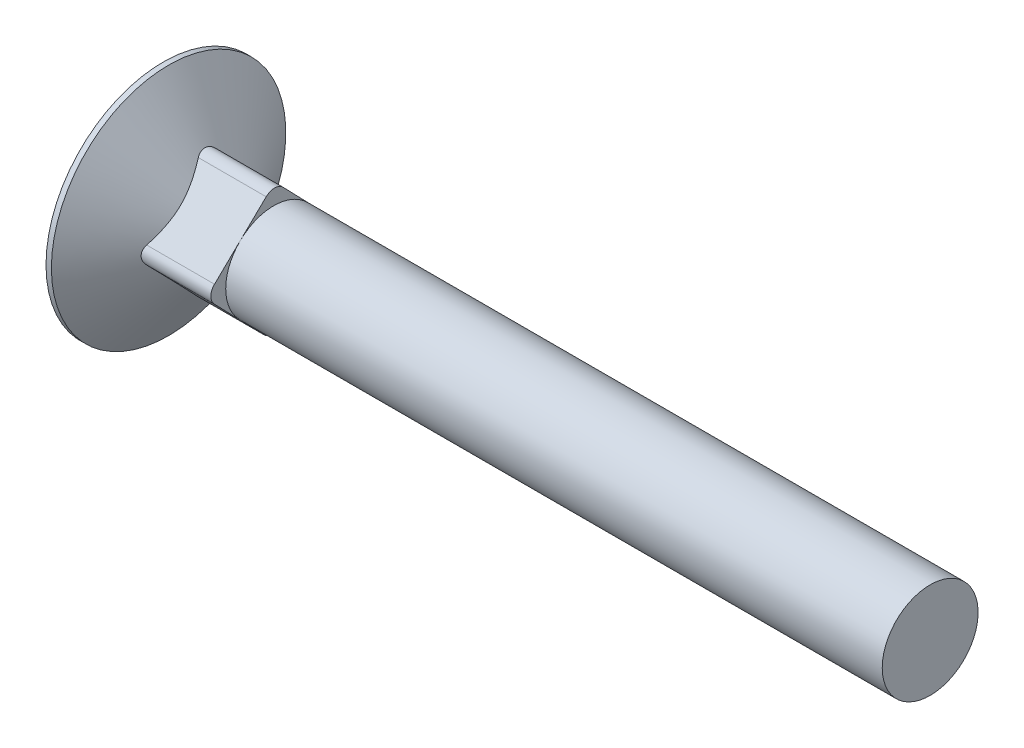
ISO-10303-21;
HEADER;
FILE_DESCRIPTION(('STEP AP214'),'2;1');
FILE_NAME('part.step','',(''),(''),'','','');
FILE_SCHEMA(('AUTOMOTIVE_DESIGN { 1 0 10303 214 1 1 1 1 }'));
ENDSEC;
DATA;
#1=APPLICATION_CONTEXT('core data for automotive mechanical design processes');
#2=APPLICATION_PROTOCOL_DEFINITION('international standard','automotive_design',2000,#1);
#3=PRODUCT_CONTEXT('',#1,'mechanical');
#4=PRODUCT('Part','Part','',(#3));
#5=PRODUCT_RELATED_PRODUCT_CATEGORY('part','',(#4));
#6=PRODUCT_DEFINITION_FORMATION('','',#4);
#7=PRODUCT_DEFINITION_CONTEXT('part definition',#1,'design');
#8=PRODUCT_DEFINITION('design','',#6,#7);
#9=PRODUCT_DEFINITION_SHAPE('','',#8);
#10=(LENGTH_UNIT() NAMED_UNIT(*) SI_UNIT(.MILLI.,.METRE.));
#11=(NAMED_UNIT(*) PLANE_ANGLE_UNIT() SI_UNIT($,.RADIAN.));
#12=(NAMED_UNIT(*) SI_UNIT($,.STERADIAN.) SOLID_ANGLE_UNIT());
#13=UNCERTAINTY_MEASURE_WITH_UNIT(LENGTH_MEASURE(1.E-05),#10,'distance_accuracy_value','');
#14=(GEOMETRIC_REPRESENTATION_CONTEXT(3) GLOBAL_UNCERTAINTY_ASSIGNED_CONTEXT((#13)) GLOBAL_UNIT_ASSIGNED_CONTEXT((#10,
#11,#12)) REPRESENTATION_CONTEXT('',''));
#15=CARTESIAN_POINT('',(0.,0.,0.));
#16=DIRECTION('',(0.,0.,1.));
#17=DIRECTION('',(1.,0.,0.));
#18=AXIS2_PLACEMENT_3D('',#15,#16,#17);
#19=CARTESIAN_POINT('',(0.533667772984279,0.,0.));
#20=DIRECTION('',(-1.,0.,0.));
#21=DIRECTION('',(0.,0.,1.));
#22=AXIS2_PLACEMENT_3D('',#19,#20,#21);
#23=CONICAL_SURFACE('',#22,11.6459,0.99483767363677);
#24=CARTESIAN_POINT('',(0.533667772984279,0.,0.));
#25=DIRECTION('',(-1.,0.,0.));
#26=DIRECTION('',(0.,0.,1.));
#27=AXIS2_PLACEMENT_3D('',#24,#25,#26);
#28=CIRCLE('',#27,11.6459);
#29=CARTESIAN_POINT('',(0.533667772984279,0.,11.6459));
#30=VERTEX_POINT('',#29);
#31=EDGE_CURVE('E217',#30,#30,#28,.T.);
#32=ORIENTED_EDGE('',*,*,#31,.F.);
#33=EDGE_LOOP('',(#32));
#34=FACE_BOUND('',#33,.T.);
#35=CARTESIAN_POINT('',(0.532123041290795,-10.9550309494248,-3.95849631330671));
#36=CARTESIAN_POINT('',(0.694883305885897,-10.7574427642457,-3.76768762084474));
#37=CARTESIAN_POINT('',(0.856904846749187,-10.559536579679,-3.57657183994382));
#38=CARTESIAN_POINT('',(1.17901780097643,-10.1628911856194,-3.19353583532146));
#39=CARTESIAN_POINT('',(1.33910905013607,-9.96415190716858,-3.00161554500828));
#40=CARTESIAN_POINT('',(1.65750023531262,-9.56490022741344,-2.61606267954588));
#41=CARTESIAN_POINT('',(1.815790759882,-9.36438393446509,-2.42242634627973));
#42=CARTESIAN_POINT('',(2.12924998907705,-8.96210112031733,-2.03394634835944));
#43=CARTESIAN_POINT('',(2.28441881792161,-8.76033464928472,-1.8391027321508));
#44=CARTESIAN_POINT('',(2.60253582699258,-8.33956733464612,-1.43277245959859));
#45=CARTESIAN_POINT('',(2.76515930232245,-8.12043891447615,-1.22116260399924));
#46=CARTESIAN_POINT('',(3.08403633959269,-7.67975137769285,-0.795595596530226));
#47=CARTESIAN_POINT('',(3.24028905207808,-7.45819194190246,-0.581638136434864));
#48=CARTESIAN_POINT('',(3.54365698242045,-7.01226444908306,-0.151010962241306));
#49=CARTESIAN_POINT('',(3.69078656178386,-6.78790151075154,0.0656538087881817));
#50=CARTESIAN_POINT('',(3.9018860636838,-6.4482959060101,0.393607129148561));
#51=CARTESIAN_POINT('',(3.97064730438402,-6.33459485484101,0.503406957946311));
#52=CARTESIAN_POINT('',(4.10429383413234,-6.10602334937034,0.724135895020092));
#53=CARTESIAN_POINT('',(4.16917940964336,-5.99115298223306,0.835064919122534));
#54=CARTESIAN_POINT('',(4.28177385213875,-5.78317650362175,1.03590546994137));
#55=CARTESIAN_POINT('',(4.33032469203292,-5.69030669237302,1.12558880418273));
#56=CARTESIAN_POINT('',(4.42392347547044,-5.50366905827458,1.30582267238815));
#57=CARTESIAN_POINT('',(4.46897188440253,-5.40990135659897,1.39637308933573));
#58=CARTESIAN_POINT('',(4.55500361240024,-5.22139771774512,1.57840893738719));
#59=CARTESIAN_POINT('',(4.59598693491075,-5.12666178138745,1.66989436769863));
#60=CARTESIAN_POINT('',(4.67326581971078,-4.93616450219971,1.85385545184152));
#61=CARTESIAN_POINT('',(4.70955912073257,-4.84040268866558,1.94633156022659));
#62=CARTESIAN_POINT('',(4.8091295722398,-4.55502583102604,2.22191678823882));
#63=CARTESIAN_POINT('',(4.86468926695932,-4.36393297493133,2.40645301431531));
#64=CARTESIAN_POINT('',(4.92839312137092,-4.07513434538459,2.68534260904826));
#65=CARTESIAN_POINT('',(4.94635423180549,-3.97851895337449,2.77864300858599));
#66=CARTESIAN_POINT('',(4.97522467462377,-3.78474984513787,2.96576366131448));
#67=CARTESIAN_POINT('',(4.98613520448874,-3.68759622315363,3.05958382349651));
#68=CARTESIAN_POINT('',(5.00114339716809,-3.48493042769018,3.25529590721291));
#69=CARTESIAN_POINT('',(5.00460096604075,-3.37939330262308,3.35721192421562));
#70=CARTESIAN_POINT('',(5.00268671479131,-3.16837391126736,3.56099098171446));
#71=CARTESIAN_POINT('',(4.99731590967165,-3.06289164006686,3.66285402695393));
#72=CARTESIAN_POINT('',(4.9779534359453,-2.85227904418269,3.86624024663226));
#73=CARTESIAN_POINT('',(4.96395674225568,-2.74714896058819,3.96776318825399));
#74=CARTESIAN_POINT('',(4.92786642620277,-2.53761848941634,4.17010441224469));
#75=CARTESIAN_POINT('',(4.90577242356377,-2.43321813634418,4.27092266129238));
#76=CARTESIAN_POINT('',(4.82813110584011,-2.12026583829367,4.57313718256983));
#77=CARTESIAN_POINT('',(4.76134680890009,-1.91314141705631,4.77315491114715));
#78=CARTESIAN_POINT('',(4.60493800089672,-1.50360200792325,5.16864252138808));
#79=CARTESIAN_POINT('',(4.51531621546499,-1.30118646117193,5.36411294273226));
#80=CARTESIAN_POINT('',(4.38782773749266,-1.04048098732727,5.61587329235482));
#81=CARTESIAN_POINT('',(4.35750714683464,-0.980222374645196,5.67406435820734));
#82=CARTESIAN_POINT('',(4.29557102761551,-0.860252977828867,5.78991745803325));
#83=CARTESIAN_POINT('',(4.26395962824818,-0.800541096155745,5.84758055188759));
#84=CARTESIAN_POINT('',(4.13398057102106,-0.560445755067062,6.0794379276604));
#85=CARTESIAN_POINT('',(4.03052564295983,-0.381483021050886,6.25226023100861));
#86=CARTESIAN_POINT('',(3.81514593234282,-0.0262023184638804,6.59535081740246));
#87=CARTESIAN_POINT('',(3.70321920398406,0.150115031304611,6.76561850287762));
#88=CARTESIAN_POINT('',(3.47287138891358,0.500787385453553,7.10425885891443));
#89=CARTESIAN_POINT('',(3.35444275736194,0.675139814497862,7.27262904250286));
#90=CARTESIAN_POINT('',(3.11274095005767,1.02207115491802,7.60765674357538));
#91=CARTESIAN_POINT('',(2.98946819067199,1.1946502171184,7.77431440670902));
#92=CARTESIAN_POINT('',(2.73739552336886,1.54081564270367,8.10860247242303));
#93=CARTESIAN_POINT('',(2.6085421377194,1.71438179897009,8.27621336121592));
#94=CARTESIAN_POINT('',(2.34779855612206,2.06033522547009,8.61029670179302));
#95=CARTESIAN_POINT('',(2.21590824900712,2.23272245224822,8.77676911161278));
#96=CARTESIAN_POINT('',(1.95011606357901,2.57601874349071,9.10828648649856));
#97=CARTESIAN_POINT('',(1.81622133982908,2.74693068021054,9.27333422526944));
#98=CARTESIAN_POINT('',(1.54648946996914,3.08793964005009,9.60264274989512));
#99=CARTESIAN_POINT('',(1.41065250096732,3.25803673560831,9.76690360570298));
#100=CARTESIAN_POINT('',(1.27405768176842,3.42781483359704,9.93085640913879));
#101=B_SPLINE_CURVE_WITH_KNOTS('',3,(#35,#36,#37,#38,#39,#40,#41,#42,#43,#44,#45,#46,#47,#48,
#49,#50,#51,#52,#53,#54,#55,#56,#57,#58,#59,#60,#61,#62,#63,#64,#65,#66,#67,#68,#69,#70,#71,#72,
#73,#74,#75,#76,#77,#78,#79,#80,#81,#82,#83,#84,#85,#86,#87,#88,#89,#90,#91,#92,#93,#94,#95,#96,
#97,#98,#99,#100),.UNSPECIFIED.,.F.,.F.,(4,2,2,2,2,2,2,2,2,2,2,2,2,2,2,2,2,2,2,2,2,2,2,2,2,2,2,
2,2,2,2,2,4),(0.,0.95784549062588,1.91577189554515,2.87743116851151,3.83905209902266,
4.87493924740397,5.91096406860663,6.94531427018273,7.46239051069423,7.97942848501689,
8.39318007820668,8.80687659947793,9.22057277016639,9.63446766381766,10.4473829126597,
10.8537514591056,11.2600509691511,11.7000480529326,12.1399945535738,12.5801975912853,
13.0204213049997,13.9057728879746,14.7910188545648,15.0582778961124,15.3247403210123,
16.1328150541036,16.941075952293,17.7502954435732,18.5594455315611,19.3800254979938,
20.2006355498063,21.0188034570577,21.8368972276177),.UNSPECIFIED.);
#102=CARTESIAN_POINT('',(4.23183585380931,-5.87541843477951,0.946828472455797));
#103=VERTEX_POINT('',#102);
#104=CARTESIAN_POINT('',(4.23183585380931,-0.741202543842446,5.90488312576984));
#105=VERTEX_POINT('',#104);
#106=EDGE_CURVE('E219',#103,#105,#101,.T.);
#107=ORIENTED_EDGE('',*,*,#106,.T.);
#108=CARTESIAN_POINT('',(4.37943289920209,-0.944352041683079,5.64550263989267));
#109=CARTESIAN_POINT('',(4.35251225172138,-0.917354132931146,5.69204724154072));
#110=CARTESIAN_POINT('',(4.32662869695987,-0.886884125443231,5.73724384122035));
#111=CARTESIAN_POINT('',(4.27730445989733,-0.819163258147915,5.82401425528748));
#112=CARTESIAN_POINT('',(4.25387265363763,-0.781889016305476,5.86557482288635));
#113=CARTESIAN_POINT('',(4.20811926058557,-0.697414775813878,5.94718776325859));
#114=CARTESIAN_POINT('',(4.18606893038301,-0.649635161773335,5.98679887910775));
#115=CARTESIAN_POINT('',(4.1461706169182,-0.547346289719177,6.05870307076282));
#116=CARTESIAN_POINT('',(4.12831825154221,-0.49284414058278,6.09100377632496));
#117=CARTESIAN_POINT('',(4.09731214307697,-0.378030410428736,6.14704165674633));
#118=CARTESIAN_POINT('',(4.08417889442371,-0.317694900334177,6.1707414835774));
#119=CARTESIAN_POINT('',(4.06322968863274,-0.193106073925886,6.2081677903357));
#120=CARTESIAN_POINT('',(4.05541340663272,-0.128852997233685,6.22189487959252));
#121=CARTESIAN_POINT('',(4.04574485411586,-0.00264031252691654,6.23807479779838));
#122=CARTESIAN_POINT('',(4.04354853264181,0.0592095301618625,6.24118215921113));
#123=CARTESIAN_POINT('',(4.04420106628737,0.182610404380761,6.23778541154474));
#124=CARTESIAN_POINT('',(4.04704886940564,0.244161495533861,6.23128330666027));
#125=CARTESIAN_POINT('',(4.05748932447082,0.362978053386332,6.20936879796813));
#126=CARTESIAN_POINT('',(4.06491236725712,0.420318116612145,6.19427631610405));
#127=CARTESIAN_POINT('',(4.0840854835171,0.531468550043161,6.15609939683231));
#128=CARTESIAN_POINT('',(4.09583456740429,0.585279724171558,6.13301678724709));
#129=CARTESIAN_POINT('',(4.12522430278153,0.695392102351437,6.0760331437259));
#130=CARTESIAN_POINT('',(4.14345974773104,0.750985972825143,6.04106952096783));
#131=CARTESIAN_POINT('',(4.1844626128213,0.854790770186582,5.96348587076843));
#132=CARTESIAN_POINT('',(4.20724090871505,0.902983478652354,5.92084749403387));
#133=CARTESIAN_POINT('',(4.26048053218472,0.997893017223193,5.82250913972399));
#134=CARTESIAN_POINT('',(4.29158558581266,1.0432204734331,5.7658090287272));
#135=CARTESIAN_POINT('',(4.34119373767082,1.10229290973849,5.6768498995237));
#136=CARTESIAN_POINT('',(4.35819619117371,1.12047838440711,5.64658957918647));
#137=CARTESIAN_POINT('',(4.39308026592529,1.15391048061844,5.58501172951802));
#138=CARTESIAN_POINT('',(4.41096112561856,1.16915959338292,5.55369512309316));
#139=CARTESIAN_POINT('',(4.42923880957495,1.18295598201111,5.52195706550892));
#140=B_SPLINE_CURVE_WITH_KNOTS('',3,(#108,#109,#110,#111,#112,#113,#114,#115,#116,#117,#118,
#119,#120,#121,#122,#123,#124,#125,#126,#127,#128,#129,#130,#131,#132,#133,#134,#135,#136,#137,
#138,#139),.UNSPECIFIED.,.F.,.F.,(4,2,2,2,2,2,2,2,2,2,2,2,2,2,2,4),(0.,0.180452366289675,
0.361536928854048,0.558281798116494,0.754820371197439,0.952202450810284,1.14957246945646,
1.33453429148954,1.51945754247436,1.69790657618928,1.87631481483309,2.07971777142122,
2.28361365741995,2.51914795489044,2.63659303753743,2.75393803597884),.UNSPECIFIED.);
#141=CARTESIAN_POINT('',(4.23183585380931,0.946828472455798,5.87541843477951));
#142=VERTEX_POINT('',#141);
#143=EDGE_CURVE('E11',#105,#142,#140,.T.);
#144=ORIENTED_EDGE('',*,*,#143,.T.);
#145=CARTESIAN_POINT('',(4.23172373168963,0.946628472455798,5.87562554084227));
#146=CARTESIAN_POINT('',(4.23172501407169,0.946630759870537,5.87562317215497));
#147=CARTESIAN_POINT('',(4.23172629645278,0.94663304728555,5.87562080346738));
#148=CARTESIAN_POINT('',(4.33105429800492,1.12380702804862,5.69215177557558));
#149=CARTESIAN_POINT('',(4.42452513050034,1.30262022915796,5.50698528531851));
#150=CARTESIAN_POINT('',(4.5955853274483,1.66399022006775,5.13277570523544));
#151=CARTESIAN_POINT('',(4.67316867639193,1.84654839915957,4.9437311767561));
#152=CARTESIAN_POINT('',(4.8069516585528,2.21499956337361,4.5621888270615));
#153=CARTESIAN_POINT('',(4.86321175726312,2.40088152968591,4.36970241615793));
#154=CARTESIAN_POINT('',(4.9276928244381,2.68184225971532,4.07875906322768));
#155=CARTESIAN_POINT('',(4.94586710452084,2.77583793164139,3.98142369558314));
#156=CARTESIAN_POINT('',(4.97506088099081,2.96435811159015,3.78620533448496));
#157=CARTESIAN_POINT('',(4.98608152073563,3.05888253266647,3.68832243106692));
#158=CARTESIAN_POINT('',(5.00115348969726,3.25542884676716,3.48479276475185));
#159=CARTESIAN_POINT('',(5.00460972090919,3.3574731601432,3.37912278490101));
#160=CARTESIAN_POINT('',(5.00267047322647,3.56152198999551,3.16782403609546));
#161=CARTESIAN_POINT('',(4.99727481112722,3.66352650560439,3.06219526803894));
#162=CARTESIAN_POINT('',(4.97783944245486,3.86719479095248,2.85129058460325));
#163=CARTESIAN_POINT('',(4.96379460672347,3.96885832248495,2.74601491589437));
#164=CARTESIAN_POINT('',(4.92758835430823,4.17147478676391,2.53619942506045));
#165=CARTESIAN_POINT('',(4.90542678721461,4.27242770630682,2.43165961660812));
#166=CARTESIAN_POINT('',(4.82769922967269,4.57449465077989,2.11886013881211));
#167=CARTESIAN_POINT('',(4.76095322752856,4.77423466928399,1.9120232947739));
#168=CARTESIAN_POINT('',(4.60469352829471,5.16917536222341,1.50305023508601));
#169=CARTESIAN_POINT('',(4.51518309461319,5.36437668293235,1.30091335020039));
#170=CARTESIAN_POINT('',(4.38785827871515,5.61581272153357,1.04054371024861));
#171=CARTESIAN_POINT('',(4.35756939788392,5.67394416805472,0.980346835191183));
#172=CARTESIAN_POINT('',(4.29563627425573,5.78979914602301,0.860375493502425));
#173=CARTESIAN_POINT('',(4.26399332064933,5.84752300708548,0.800600685544418));
#174=CARTESIAN_POINT('',(4.23172629645279,5.90507855094009,0.741000175154581));
#175=CARTESIAN_POINT('',(4.2317250140717,5.9050808383551,0.740997806466995));
#176=CARTESIAN_POINT('',(4.23172373168963,5.90508312576984,0.740995437779688));
#177=B_SPLINE_CURVE_WITH_KNOTS('',3,(#145,#146,#147,#148,#149,#150,#151,#152,#153,#154,#155,
#156,#157,#158,#159,#160,#161,#162,#163,#164,#165,#166,#167,#168,#169,#170,#171,#172,#173,#174,
#175,#176),.UNSPECIFIED.,.F.,.F.,(4,2,2,2,2,2,2,2,2,2,2,2,2,2,2,4),(0.,1.06012756846988E-05,
0.821132142249428,1.64256401355531,2.46164883875024,2.87106894383615,3.2804235956842,
3.72097324252699,4.16153200738961,4.60235228562504,5.04318073304005,5.92734592577175,
6.81138443986919,7.07837005671815,7.34510690281087,7.34511750408656),.UNSPECIFIED.);
#178=CARTESIAN_POINT('',(4.23183585380931,5.90488312576984,0.741202543842446));
#179=VERTEX_POINT('',#178);
#180=EDGE_CURVE('E226',#142,#179,#177,.T.);
#181=ORIENTED_EDGE('',*,*,#180,.T.);
#182=CARTESIAN_POINT('',(4.37943289920208,5.64550263989267,0.944352041683078));
#183=CARTESIAN_POINT('',(4.35251225172138,5.69204724154072,0.917354132931146));
#184=CARTESIAN_POINT('',(4.32662869695986,5.73724384122035,0.88688412544323));
#185=CARTESIAN_POINT('',(4.27730445989733,5.82401425528748,0.819163258147914));
#186=CARTESIAN_POINT('',(4.25387265363763,5.86557482288635,0.781889016305475));
#187=CARTESIAN_POINT('',(4.20811926058557,5.9471877632586,0.697414775813878));
#188=CARTESIAN_POINT('',(4.18606893038301,5.98679887910775,0.649635161773335));
#189=CARTESIAN_POINT('',(4.1461706169182,6.05870307076282,0.547346289719177));
#190=CARTESIAN_POINT('',(4.12831825154221,6.09100377632496,0.49284414058278));
#191=CARTESIAN_POINT('',(4.09731214307697,6.14704165674634,0.378030410428736));
#192=CARTESIAN_POINT('',(4.08417889442371,6.1707414835774,0.317694900334177));
#193=CARTESIAN_POINT('',(4.06322968863274,6.2081677903357,0.193106073925885));
#194=CARTESIAN_POINT('',(4.05541340663272,6.22189487959252,0.128852997233684));
#195=CARTESIAN_POINT('',(4.04574485411586,6.23807479779838,0.00264031252691575));
#196=CARTESIAN_POINT('',(4.04354853264181,6.24118215921113,-0.0592095301618635));
#197=CARTESIAN_POINT('',(4.04420106628737,6.23778541154474,-0.182610404380762));
#198=CARTESIAN_POINT('',(4.04704886940564,6.23128330666027,-0.244161495533862));
#199=CARTESIAN_POINT('',(4.05748932447082,6.20936879796813,-0.362978053386333));
#200=CARTESIAN_POINT('',(4.06491236725712,6.19427631610405,-0.420318116612146));
#201=CARTESIAN_POINT('',(4.0840854835171,6.15609939683231,-0.531468550043162));
#202=CARTESIAN_POINT('',(4.09583456740429,6.13301678724709,-0.585279724171559));
#203=CARTESIAN_POINT('',(4.12522430278153,6.0760331437259,-0.695392102351438));
#204=CARTESIAN_POINT('',(4.14345974773104,6.04106952096783,-0.750985972825143));
#205=CARTESIAN_POINT('',(4.1844626128213,5.96348587076844,-0.854790770186582));
#206=CARTESIAN_POINT('',(4.20724090871505,5.92084749403387,-0.902983478652353));
#207=CARTESIAN_POINT('',(4.26048053218472,5.82250913972399,-0.997893017223193));
#208=CARTESIAN_POINT('',(4.29158558581266,5.7658090287272,-1.04322047343309));
#209=CARTESIAN_POINT('',(4.34119373767081,5.6768498995237,-1.10229290973848));
#210=CARTESIAN_POINT('',(4.35819619117371,5.64658957918647,-1.12047838440711));
#211=CARTESIAN_POINT('',(4.39308026592529,5.58501172951803,-1.15391048061844));
#212=CARTESIAN_POINT('',(4.41096112561856,5.55369512309316,-1.16915959338292));
#213=CARTESIAN_POINT('',(4.42923880957495,5.52195706550892,-1.18295598201111));
#214=B_SPLINE_CURVE_WITH_KNOTS('',3,(#182,#183,#184,#185,#186,#187,#188,#189,#190,#191,#192,
#193,#194,#195,#196,#197,#198,#199,#200,#201,#202,#203,#204,#205,#206,#207,#208,#209,#210,#211,
#212,#213),.UNSPECIFIED.,.F.,.F.,(4,2,2,2,2,2,2,2,2,2,2,2,2,2,2,4),(0.,0.180452366289674,
0.361536928854045,0.558281798116491,0.754820371197437,0.952202450810281,1.14957246945646,
1.33453429148954,1.51945754247436,1.69790657618927,1.87631481483309,2.07971777142122,
2.28361365741995,2.51914795489043,2.63659303753743,2.75393803597883),.UNSPECIFIED.);
#215=CARTESIAN_POINT('',(4.23183585380931,5.87541843477952,-0.946828472455798));
#216=VERTEX_POINT('',#215);
#217=EDGE_CURVE('E138',#179,#216,#214,.T.);
#218=ORIENTED_EDGE('',*,*,#217,.T.);
#219=CARTESIAN_POINT('',(0.532123041290795,10.9550309494248,3.95849631330672));
#220=CARTESIAN_POINT('',(0.694883305885898,10.7574427642457,3.76768762084474));
#221=CARTESIAN_POINT('',(0.856904846749187,10.559536579679,3.57657183994382));
#222=CARTESIAN_POINT('',(1.17901780097643,10.1628911856194,3.19353583532146));
#223=CARTESIAN_POINT('',(1.33910905013607,9.96415190716858,3.00161554500828));
#224=CARTESIAN_POINT('',(1.65750023531262,9.56490022741344,2.61606267954588));
#225=CARTESIAN_POINT('',(1.815790759882,9.36438393446509,2.42242634627973));
#226=CARTESIAN_POINT('',(2.12924998907705,8.96210112031734,2.03394634835944));
#227=CARTESIAN_POINT('',(2.28441881792161,8.76033464928472,1.8391027321508));
#228=CARTESIAN_POINT('',(2.60253582699258,8.33956733464612,1.43277245959859));
#229=CARTESIAN_POINT('',(2.76515930232245,8.12043891447615,1.22116260399924));
#230=CARTESIAN_POINT('',(3.08403633959269,7.67975137769285,0.795595596530226));
#231=CARTESIAN_POINT('',(3.24028905207808,7.45819194190247,0.581638136434864));
#232=CARTESIAN_POINT('',(3.54365698242045,7.01226444908307,0.151010962241306));
#233=CARTESIAN_POINT('',(3.69078656178386,6.78790151075154,-0.0656538087881817));
#234=CARTESIAN_POINT('',(3.9018860636838,6.4482959060101,-0.393607129148561));
#235=CARTESIAN_POINT('',(3.97064730438402,6.33459485484101,-0.503406957946311));
#236=CARTESIAN_POINT('',(4.10429383413234,6.10602334937034,-0.724135895020092));
#237=CARTESIAN_POINT('',(4.16917940964336,5.99115298223306,-0.835064919122535));
#238=CARTESIAN_POINT('',(4.28177385213875,5.78317650362175,-1.03590546994138));
#239=CARTESIAN_POINT('',(4.33032469203292,5.69030669237302,-1.12558880418273));
#240=CARTESIAN_POINT('',(4.42392347547044,5.50366905827458,-1.30582267238815));
#241=CARTESIAN_POINT('',(4.46897188440253,5.40990135659897,-1.39637308933573));
#242=CARTESIAN_POINT('',(4.55500361240024,5.22139771774512,-1.57840893738719));
#243=CARTESIAN_POINT('',(4.59598693491075,5.12666178138745,-1.66989436769863));
#244=CARTESIAN_POINT('',(4.67326581971078,4.93616450219971,-1.85385545184152));
#245=CARTESIAN_POINT('',(4.70955912073257,4.84040268866559,-1.94633156022659));
#246=CARTESIAN_POINT('',(4.80912957223979,4.55502583102604,-2.22191678823882));
#247=CARTESIAN_POINT('',(4.86468926695932,4.36393297493133,-2.40645301431531));
#248=CARTESIAN_POINT('',(4.92839312137092,4.07513434538459,-2.68534260904826));
#249=CARTESIAN_POINT('',(4.94635423180549,3.97851895337449,-2.778643008586));
#250=CARTESIAN_POINT('',(4.97522467462377,3.78474984513787,-2.96576366131448));
#251=CARTESIAN_POINT('',(4.98613520448875,3.68759622315363,-3.05958382349651));
#252=CARTESIAN_POINT('',(5.00114339716809,3.48493042769018,-3.25529590721291));
#253=CARTESIAN_POINT('',(5.00460096604075,3.37939330262308,-3.35721192421562));
#254=CARTESIAN_POINT('',(5.00268671479131,3.16837391126736,-3.56099098171446));
#255=CARTESIAN_POINT('',(4.99731590967165,3.06289164006686,-3.66285402695393));
#256=CARTESIAN_POINT('',(4.9779534359453,2.85227904418269,-3.86624024663226));
#257=CARTESIAN_POINT('',(4.96395674225568,2.74714896058819,-3.96776318825399));
#258=CARTESIAN_POINT('',(4.92786642620277,2.53761848941634,-4.17010441224469));
#259=CARTESIAN_POINT('',(4.90577242356377,2.43321813634418,-4.27092266129238));
#260=CARTESIAN_POINT('',(4.82813110584011,2.12026583829367,-4.57313718256983));
#261=CARTESIAN_POINT('',(4.76134680890009,1.91314141705631,-4.77315491114716));
#262=CARTESIAN_POINT('',(4.60493800089671,1.50360200792325,-5.16864252138808));
#263=CARTESIAN_POINT('',(4.51531621546499,1.30118646117193,-5.36411294273227));
#264=CARTESIAN_POINT('',(4.38782773749266,1.04048098732727,-5.61587329235482));
#265=CARTESIAN_POINT('',(4.35750714683463,0.980222374645194,-5.67406435820734));
#266=CARTESIAN_POINT('',(4.29557102761551,0.860252977828866,-5.78991745803325));
#267=CARTESIAN_POINT('',(4.26395962824817,0.800541096155745,-5.84758055188759));
#268=CARTESIAN_POINT('',(4.13398057102106,0.560445755067062,-6.07943792766041));
#269=CARTESIAN_POINT('',(4.03052564295983,0.381483021050886,-6.25226023100861));
#270=CARTESIAN_POINT('',(3.81514593234282,0.0262023184638792,-6.59535081740246));
#271=CARTESIAN_POINT('',(3.70321920398406,-0.150115031304613,-6.76561850287762));
#272=CARTESIAN_POINT('',(3.47287138891357,-0.500787385453558,-7.10425885891443));
#273=CARTESIAN_POINT('',(3.35444275736194,-0.675139814497866,-7.27262904250287));
#274=CARTESIAN_POINT('',(3.11274095005767,-1.02207115491803,-7.60765674357539));
#275=CARTESIAN_POINT('',(2.98946819067198,-1.1946502171184,-7.77431440670903));
#276=CARTESIAN_POINT('',(2.73739552336885,-1.54081564270368,-8.10860247242304));
#277=CARTESIAN_POINT('',(2.60854213771939,-1.71438179897009,-8.27621336121593));
#278=CARTESIAN_POINT('',(2.34779855612206,-2.0603352254701,-8.61029670179303));
#279=CARTESIAN_POINT('',(2.21590824900712,-2.23272245224822,-8.77676911161278));
#280=CARTESIAN_POINT('',(1.95011606357901,-2.57601874349072,-9.10828648649857));
#281=CARTESIAN_POINT('',(1.81622133982908,-2.74693068021055,-9.27333422526944));
#282=CARTESIAN_POINT('',(1.54648946996913,-3.08793964005009,-9.60264274989513));
#283=CARTESIAN_POINT('',(1.41065250096731,-3.25803673560831,-9.76690360570298));
#284=CARTESIAN_POINT('',(1.27405768176842,-3.42781483359704,-9.9308564091388));
#285=B_SPLINE_CURVE_WITH_KNOTS('',3,(#219,#220,#221,#222,#223,#224,#225,#226,#227,#228,#229,
#230,#231,#232,#233,#234,#235,#236,#237,#238,#239,#240,#241,#242,#243,#244,#245,#246,#247,#248,
#249,#250,#251,#252,#253,#254,#255,#256,#257,#258,#259,#260,#261,#262,#263,#264,#265,#266,#267,
#268,#269,#270,#271,#272,#273,#274,#275,#276,#277,#278,#279,#280,#281,#282,#283,#284),
.UNSPECIFIED.,.F.,.F.,(4,2,2,2,2,2,2,2,2,2,2,2,2,2,2,2,2,2,2,2,2,2,2,2,2,2,2,2,2,2,2,2,4),(0.,
0.95784549062588,1.91577189554515,2.87743116851151,3.83905209902266,4.87493924740397,
5.91096406860663,6.94531427018273,7.46239051069423,7.97942848501689,8.39318007820668,
8.80687659947793,9.22057277016639,9.63446766381766,10.4473829126597,10.8537514591056,
11.2600509691511,11.7000480529326,12.1399945535738,12.5801975912853,13.0204213049997,
13.9057728879746,14.7910188545648,15.0582778961124,15.3247403210123,16.1328150541036,
16.941075952293,17.7502954435732,18.5594455315611,19.3800254979938,20.2006355498063,
21.0188034570577,21.8368972276177),.UNSPECIFIED.);
#286=CARTESIAN_POINT('',(4.23183585380931,0.741202543842447,-5.90488312576984));
#287=VERTEX_POINT('',#286);
#288=EDGE_CURVE('E52',#216,#287,#285,.T.);
#289=ORIENTED_EDGE('',*,*,#288,.T.);
#290=CARTESIAN_POINT('',(4.37943289920209,0.94435204168308,-5.64550263989267));
#291=CARTESIAN_POINT('',(4.35251225172138,0.917354132931147,-5.69204724154072));
#292=CARTESIAN_POINT('',(4.32662869695986,0.886884125443232,-5.73724384122035));
#293=CARTESIAN_POINT('',(4.27730445989733,0.819163258147915,-5.82401425528748));
#294=CARTESIAN_POINT('',(4.25387265363763,0.781889016305477,-5.86557482288635));
#295=CARTESIAN_POINT('',(4.20811926058557,0.697414775813879,-5.94718776325859));
#296=CARTESIAN_POINT('',(4.18606893038301,0.649635161773336,-5.98679887910775));
#297=CARTESIAN_POINT('',(4.1461706169182,0.547346289719177,-6.05870307076282));
#298=CARTESIAN_POINT('',(4.12831825154221,0.492844140582781,-6.09100377632496));
#299=CARTESIAN_POINT('',(4.09731214307697,0.378030410428737,-6.14704165674633));
#300=CARTESIAN_POINT('',(4.08417889442371,0.317694900334178,-6.1707414835774));
#301=CARTESIAN_POINT('',(4.06322968863274,0.193106073925886,-6.2081677903357));
#302=CARTESIAN_POINT('',(4.05541340663272,0.128852997233686,-6.22189487959252));
#303=CARTESIAN_POINT('',(4.04574485411586,0.00264031252691732,-6.23807479779838));
#304=CARTESIAN_POINT('',(4.04354853264181,-0.0592095301618618,-6.24118215921113));
#305=CARTESIAN_POINT('',(4.04420106628737,-0.18261040438076,-6.23778541154474));
#306=CARTESIAN_POINT('',(4.04704886940564,-0.244161495533861,-6.23128330666027));
#307=CARTESIAN_POINT('',(4.05748932447082,-0.362978053386331,-6.20936879796813));
#308=CARTESIAN_POINT('',(4.06491236725712,-0.420318116612144,-6.19427631610405));
#309=CARTESIAN_POINT('',(4.0840854835171,-0.53146855004316,-6.15609939683231));
#310=CARTESIAN_POINT('',(4.09583456740429,-0.585279724171558,-6.13301678724709));
#311=CARTESIAN_POINT('',(4.12522430278153,-0.695392102351437,-6.0760331437259));
#312=CARTESIAN_POINT('',(4.14345974773104,-0.750985972825142,-6.04106952096783));
#313=CARTESIAN_POINT('',(4.1844626128213,-0.854790770186582,-5.96348587076844));
#314=CARTESIAN_POINT('',(4.20724090871505,-0.902983478652353,-5.92084749403387));
#315=CARTESIAN_POINT('',(4.26048053218472,-0.997893017223192,-5.82250913972399));
#316=CARTESIAN_POINT('',(4.29158558581266,-1.04322047343309,-5.7658090287272));
#317=CARTESIAN_POINT('',(4.34119373767081,-1.10229290973848,-5.6768498995237));
#318=CARTESIAN_POINT('',(4.35819619117371,-1.12047838440711,-5.64658957918647));
#319=CARTESIAN_POINT('',(4.39308026592529,-1.15391048061844,-5.58501172951803));
#320=CARTESIAN_POINT('',(4.41096112561856,-1.16915959338292,-5.55369512309316));
#321=CARTESIAN_POINT('',(4.42923880957495,-1.18295598201111,-5.52195706550892));
#322=B_SPLINE_CURVE_WITH_KNOTS('',3,(#290,#291,#292,#293,#294,#295,#296,#297,#298,#299,#300,
#301,#302,#303,#304,#305,#306,#307,#308,#309,#310,#311,#312,#313,#314,#315,#316,#317,#318,#319,
#320,#321),.UNSPECIFIED.,.F.,.F.,(4,2,2,2,2,2,2,2,2,2,2,2,2,2,2,4),(0.,0.180452366289676,
0.361536928854048,0.558281798116493,0.75482037119744,0.952202450810284,1.14957246945646,
1.33453429148954,1.51945754247436,1.69790657618928,1.87631481483309,2.07971777142122,
2.28361365741995,2.51914795489044,2.63659303753743,2.75393803597884),.UNSPECIFIED.);
#323=CARTESIAN_POINT('',(4.23183585380931,-0.946828472455797,-5.87541843477951));
#324=VERTEX_POINT('',#323);
#325=EDGE_CURVE('E176',#287,#324,#322,.T.);
#326=ORIENTED_EDGE('',*,*,#325,.T.);
#327=CARTESIAN_POINT('',(4.23172373168963,-0.946628472455798,-5.87562554084227));
#328=CARTESIAN_POINT('',(4.23172501407169,-0.946630759870537,-5.87562317215497));
#329=CARTESIAN_POINT('',(4.23172629645278,-0.94663304728555,-5.87562080346738));
#330=CARTESIAN_POINT('',(4.33105429799441,-1.12380702805227,-5.6921517755726));
#331=CARTESIAN_POINT('',(4.42452513049785,-1.30262022915955,-5.50698528531707));
#332=CARTESIAN_POINT('',(4.59558532745169,-1.66399022006804,-5.13277570523492));
#333=CARTESIAN_POINT('',(4.67316867639321,-1.84654839916063,-4.94373117675495));
#334=CARTESIAN_POINT('',(4.80695165855237,-2.21499956337486,-4.56218882706026));
#335=CARTESIAN_POINT('',(4.86321175726315,-2.4008815296866,-4.36970241615722));
#336=CARTESIAN_POINT('',(4.92769282443821,-2.68184225971552,-4.07875906322748));
#337=CARTESIAN_POINT('',(4.94586710452089,-2.77583793164155,-3.98142369558297));
#338=CARTESIAN_POINT('',(4.9750608809908,-2.96435811159024,-3.78620533448487));
#339=CARTESIAN_POINT('',(4.98608152073563,-3.05888253266651,-3.68832243106688));
#340=CARTESIAN_POINT('',(5.00115348969726,-3.25542884676712,-3.48479276475189));
#341=CARTESIAN_POINT('',(5.00460972090919,-3.35747316014313,-3.37912278490109));
#342=CARTESIAN_POINT('',(5.00267047322647,-3.56152198999536,-3.16782403609562));
#343=CARTESIAN_POINT('',(4.99727481112723,-3.6635265056042,-3.06219526803915));
#344=CARTESIAN_POINT('',(4.97783944245491,-3.86719479095209,-2.85129058460364));
#345=CARTESIAN_POINT('',(4.96379460672355,-3.96885832248442,-2.74601491589489));
#346=CARTESIAN_POINT('',(4.92758835430839,-4.17147478676312,-2.53619942506129));
#347=CARTESIAN_POINT('',(4.9054267872148,-4.27242770630593,-2.43165961660913));
#348=CARTESIAN_POINT('',(4.82769922967302,-4.57449465077888,-2.11886013881296));
#349=CARTESIAN_POINT('',(4.76095322752904,-4.77423466928271,-1.91202329477413));
#350=CARTESIAN_POINT('',(4.60469352829472,-5.16917536222347,-1.50305023508703));
#351=CARTESIAN_POINT('',(4.51518309461256,-5.36437668293402,-1.30091335020283));
#352=CARTESIAN_POINT('',(4.38785827871537,-5.61581272153301,-1.04054371024794));
#353=CARTESIAN_POINT('',(4.35756939788449,-5.67394416805329,-0.980346835189496));
#354=CARTESIAN_POINT('',(4.29563627425517,-5.78979914602444,-0.860375493504114));
#355=CARTESIAN_POINT('',(4.26399332064731,-5.84752300709065,-0.800600685550498));
#356=CARTESIAN_POINT('',(4.23172629645279,-5.90507855094009,-0.741000175154582));
#357=CARTESIAN_POINT('',(4.2317250140717,-5.9050808383551,-0.740997806466997));
#358=CARTESIAN_POINT('',(4.23172373168963,-5.90508312576984,-0.74099543777969));
#359=B_SPLINE_CURVE_WITH_KNOTS('',3,(#327,#328,#329,#330,#331,#332,#333,#334,#335,#336,#337,
#338,#339,#340,#341,#342,#343,#344,#345,#346,#347,#348,#349,#350,#351,#352,#353,#354,#355,#356,
#357,#358),.UNSPECIFIED.,.F.,.F.,(4,2,2,2,2,2,2,2,2,2,2,2,2,2,2,4),(0.,1.06012756858417E-05,
0.821132142251057,1.64256401355738,2.46164883875063,2.87106894383632,3.2804235956842,
3.72097324252683,4.16153200738927,4.60235228562408,5.04318073303849,5.92734592577077,
6.81138443986919,7.07837005671814,7.34510690281087,7.34511750408656),.UNSPECIFIED.);
#360=CARTESIAN_POINT('',(4.23183585380931,-5.90488312576984,-0.741202543842447));
#361=VERTEX_POINT('',#360);
#362=EDGE_CURVE('E141',#324,#361,#359,.T.);
#363=ORIENTED_EDGE('',*,*,#362,.T.);
#364=CARTESIAN_POINT('',(4.37943289920208,-5.64550263989267,-0.944352041683079));
#365=CARTESIAN_POINT('',(4.35251225172138,-5.69204724154072,-0.917354132931147));
#366=CARTESIAN_POINT('',(4.32662869695986,-5.73724384122035,-0.886884125443231));
#367=CARTESIAN_POINT('',(4.27730445989733,-5.82401425528748,-0.819163258147915));
#368=CARTESIAN_POINT('',(4.25387265363763,-5.86557482288635,-0.781889016305477));
#369=CARTESIAN_POINT('',(4.20811926058557,-5.94718776325859,-0.697414775813879));
#370=CARTESIAN_POINT('',(4.18606893038301,-5.98679887910775,-0.649635161773336));
#371=CARTESIAN_POINT('',(4.1461706169182,-6.05870307076282,-0.547346289719177));
#372=CARTESIAN_POINT('',(4.12831825154221,-6.09100377632496,-0.492844140582781));
#373=CARTESIAN_POINT('',(4.09731214307697,-6.14704165674633,-0.378030410428737));
#374=CARTESIAN_POINT('',(4.08417889442371,-6.1707414835774,-0.317694900334178));
#375=CARTESIAN_POINT('',(4.06322968863274,-6.2081677903357,-0.193106073925886));
#376=CARTESIAN_POINT('',(4.05541340663272,-6.22189487959252,-0.128852997233686));
#377=CARTESIAN_POINT('',(4.04574485411586,-6.23807479779838,-0.00264031252691726));
#378=CARTESIAN_POINT('',(4.04354853264181,-6.24118215921113,0.059209530161862));
#379=CARTESIAN_POINT('',(4.04420106628737,-6.23778541154474,0.18261040438076));
#380=CARTESIAN_POINT('',(4.04704886940564,-6.23128330666027,0.244161495533861));
#381=CARTESIAN_POINT('',(4.05748932447082,-6.20936879796813,0.362978053386331));
#382=CARTESIAN_POINT('',(4.06491236725712,-6.19427631610405,0.420318116612144));
#383=CARTESIAN_POINT('',(4.0840854835171,-6.15609939683231,0.53146855004316));
#384=CARTESIAN_POINT('',(4.09583456740429,-6.13301678724709,0.585279724171558));
#385=CARTESIAN_POINT('',(4.12522430278153,-6.0760331437259,0.695392102351437));
#386=CARTESIAN_POINT('',(4.14345974773104,-6.04106952096783,0.750985972825142));
#387=CARTESIAN_POINT('',(4.1844626128213,-5.96348587076844,0.854790770186581));
#388=CARTESIAN_POINT('',(4.20724090871505,-5.92084749403387,0.902983478652353));
#389=CARTESIAN_POINT('',(4.26048053218472,-5.82250913972399,0.997893017223192));
#390=CARTESIAN_POINT('',(4.29158558581266,-5.7658090287272,1.04322047343309));
#391=CARTESIAN_POINT('',(4.34119373767081,-5.6768498995237,1.10229290973848));
#392=CARTESIAN_POINT('',(4.35819619117371,-5.64658957918647,1.12047838440711));
#393=CARTESIAN_POINT('',(4.39308026592528,-5.58501172951802,1.15391048061844));
#394=CARTESIAN_POINT('',(4.41096112561856,-5.55369512309316,1.16915959338292));
#395=CARTESIAN_POINT('',(4.42923880957495,-5.52195706550892,1.18295598201111));
#396=B_SPLINE_CURVE_WITH_KNOTS('',3,(#364,#365,#366,#367,#368,#369,#370,#371,#372,#373,#374,
#375,#376,#377,#378,#379,#380,#381,#382,#383,#384,#385,#386,#387,#388,#389,#390,#391,#392,#393,
#394,#395),.UNSPECIFIED.,.F.,.F.,(4,2,2,2,2,2,2,2,2,2,2,2,2,2,2,4),(0.,0.180452366289674,
0.361536928854046,0.558281798116491,0.754820371197438,0.952202450810282,1.14957246945646,
1.33453429148954,1.51945754247436,1.69790657618928,1.87631481483309,2.07971777142122,
2.28361365741995,2.51914795489043,2.63659303753743,2.75393803597883),.UNSPECIFIED.);
#397=EDGE_CURVE('E45',#361,#103,#396,.T.);
#398=ORIENTED_EDGE('',*,*,#397,.T.);
#399=EDGE_LOOP('',(#107,#144,#181,#218,#289,#326,#363,#398));
#400=FACE_BOUND('',#399,.T.);
#401=ADVANCED_FACE('F32',(#34,#400),#23,.T.);
#402=CARTESIAN_POINT('',(0.,0.,0.));
#403=DIRECTION('',(-1.,0.,0.));
#404=DIRECTION('',(0.,0.,1.));
#405=AXIS2_PLACEMENT_3D('',#402,#403,#404);
#406=PLANE('',#405);
#407=CARTESIAN_POINT('',(0.,0.,0.));
#408=DIRECTION('',(-1.,0.,0.));
#409=DIRECTION('',(0.,0.,1.));
#410=AXIS2_PLACEMENT_3D('',#407,#408,#409);
#411=CIRCLE('',#410,11.6459);
#412=CARTESIAN_POINT('',(0.,0.,11.6459));
#413=VERTEX_POINT('',#412);
#414=EDGE_CURVE('E271',#413,#413,#411,.T.);
#415=ORIENTED_EDGE('',*,*,#414,.T.);
#416=EDGE_LOOP('',(#415));
#417=FACE_BOUND('',#416,.T.);
#418=ADVANCED_FACE('F34',(#417),#406,.T.);
#419=CARTESIAN_POINT('',(-6.34999999999999,0.,0.));
#420=DIRECTION('',(-1.,0.,0.));
#421=DIRECTION('',(0.,0.,1.));
#422=AXIS2_PLACEMENT_3D('',#419,#420,#421);
#423=CYLINDRICAL_SURFACE('',#422,11.6459);
#424=ORIENTED_EDGE('',*,*,#31,.T.);
#425=EDGE_LOOP('',(#424));
#426=FACE_BOUND('',#425,.T.);
#427=ORIENTED_EDGE('',*,*,#414,.F.);
#428=EDGE_LOOP('',(#427));
#429=FACE_BOUND('',#428,.T.);
#430=ADVANCED_FACE('F213',(#426,#429),#423,.T.);
#431=CARTESIAN_POINT('',(10.9728,5.90488312576984,0.741202543842446));
#432=DIRECTION('',(0.,-0.71933980033865,-0.694658370458999));
#433=DIRECTION('',(0.,0.694658370458999,-0.71933980033865));
#434=AXIS2_PLACEMENT_3D('',#431,#432,#433);
#435=PLANE('',#434);
#436=ORIENTED_EDGE('',*,*,#180,.F.);
#437=DIRECTION('',(-1.,0.,0.));
#438=VECTOR('',#437,1.);
#439=CARTESIAN_POINT('',(10.9728,0.946828472455798,5.87541843477951));
#440=LINE('',#439,#438);
#441=CARTESIAN_POINT('',(10.9728,0.946828472455798,5.87541843477951));
#442=VERTEX_POINT('',#441);
#443=EDGE_CURVE('E139',#442,#142,#440,.T.);
#444=ORIENTED_EDGE('',*,*,#443,.F.);
#445=DIRECTION('',(0.,-0.694658370458998,0.71933980033865));
#446=VECTOR('',#445,1.);
#447=CARTESIAN_POINT('',(10.9728,5.90488312576984,0.741202543842446));
#448=LINE('',#447,#446);
#449=CARTESIAN_POINT('',(10.9728,3.42585579911282,3.30831048931098));
#450=VERTEX_POINT('',#449);
#451=EDGE_CURVE('E122',#450,#442,#448,.T.);
#452=ORIENTED_EDGE('',*,*,#451,.F.);
#453=CARTESIAN_POINT('',(10.9728,5.90488312576984,0.741202543842446));
#454=VERTEX_POINT('',#453);
#455=EDGE_CURVE('E116',#454,#450,#448,.T.);
#456=ORIENTED_EDGE('',*,*,#455,.F.);
#457=DIRECTION('',(-1.,0.,0.));
#458=VECTOR('',#457,1.);
#459=CARTESIAN_POINT('',(10.9728,5.90488312576984,0.741202543842446));
#460=LINE('',#459,#458);
#461=EDGE_CURVE('E120',#454,#179,#460,.T.);
#462=ORIENTED_EDGE('',*,*,#461,.T.);
#463=EDGE_LOOP('',(#436,#444,#452,#456,#462));
#464=FACE_BOUND('',#463,.T.);
#465=ADVANCED_FACE('F118',(#464),#435,.F.);
#466=CARTESIAN_POINT('',(10.9728,-5.87541843477951,0.946828472455797));
#467=DIRECTION('',(0.,0.694658370458999,-0.71933980033865));
#468=DIRECTION('',(0.,0.71933980033865,0.694658370458999));
#469=AXIS2_PLACEMENT_3D('',#466,#467,#468);
#470=PLANE('',#469);
#471=ORIENTED_EDGE('',*,*,#106,.F.);
#472=DIRECTION('',(-1.,0.,0.));
#473=VECTOR('',#472,1.);
#474=CARTESIAN_POINT('',(10.9728,-5.87541843477951,0.946828472455797));
#475=LINE('',#474,#473);
#476=CARTESIAN_POINT('',(10.9728,-5.87541843477951,0.946828472455797));
#477=VERTEX_POINT('',#476);
#478=EDGE_CURVE('E231',#477,#103,#475,.T.);
#479=ORIENTED_EDGE('',*,*,#478,.F.);
#480=DIRECTION('',(0.,-0.71933980033865,-0.694658370458998));
#481=VECTOR('',#480,1.);
#482=CARTESIAN_POINT('',(10.9728,-5.87541843477951,0.946828472455797));
#483=LINE('',#482,#481);
#484=CARTESIAN_POINT('',(10.9728,-3.30831048931098,3.42585579911282));
#485=VERTEX_POINT('',#484);
#486=EDGE_CURVE('E256',#485,#477,#483,.T.);
#487=ORIENTED_EDGE('',*,*,#486,.F.);
#488=CARTESIAN_POINT('',(10.9728,-0.741202543842446,5.90488312576984));
#489=VERTEX_POINT('',#488);
#490=EDGE_CURVE('E60',#489,#485,#483,.T.);
#491=ORIENTED_EDGE('',*,*,#490,.F.);
#492=DIRECTION('',(-1.,0.,0.));
#493=VECTOR('',#492,1.);
#494=CARTESIAN_POINT('',(10.9728,-0.741202543842446,5.90488312576984));
#495=LINE('',#494,#493);
#496=EDGE_CURVE('E144',#489,#105,#495,.T.);
#497=ORIENTED_EDGE('',*,*,#496,.T.);
#498=EDGE_LOOP('',(#471,#479,#487,#491,#497));
#499=FACE_BOUND('',#498,.T.);
#500=ADVANCED_FACE('F230',(#499),#470,.F.);
#501=CARTESIAN_POINT('',(10.9728,-0.946828472455797,-5.87541843477951));
#502=DIRECTION('',(0.,0.71933980033865,0.694658370458999));
#503=DIRECTION('',(0.,-0.694658370458999,0.71933980033865));
#504=AXIS2_PLACEMENT_3D('',#501,#502,#503);
#505=PLANE('',#504);
#506=ORIENTED_EDGE('',*,*,#362,.F.);
#507=DIRECTION('',(-1.,0.,0.));
#508=VECTOR('',#507,1.);
#509=CARTESIAN_POINT('',(10.9728,-0.946828472455797,-5.87541843477951));
#510=LINE('',#509,#508);
#511=CARTESIAN_POINT('',(10.9728,-0.946828472455797,-5.87541843477951));
#512=VERTEX_POINT('',#511);
#513=EDGE_CURVE('E237',#512,#324,#510,.T.);
#514=ORIENTED_EDGE('',*,*,#513,.F.);
#515=DIRECTION('',(0.,0.694658370458999,-0.71933980033865));
#516=VECTOR('',#515,1.);
#517=CARTESIAN_POINT('',(10.9728,-0.946828472455797,-5.87541843477951));
#518=LINE('',#517,#516);
#519=CARTESIAN_POINT('',(10.9728,-3.42585579911282,-3.30831048931098));
#520=VERTEX_POINT('',#519);
#521=EDGE_CURVE('E252',#520,#512,#518,.T.);
#522=ORIENTED_EDGE('',*,*,#521,.F.);
#523=CARTESIAN_POINT('',(10.9728,-5.90488312576984,-0.741202543842447));
#524=VERTEX_POINT('',#523);
#525=EDGE_CURVE('E249',#524,#520,#518,.T.);
#526=ORIENTED_EDGE('',*,*,#525,.F.);
#527=DIRECTION('',(-1.,0.,0.));
#528=VECTOR('',#527,1.);
#529=CARTESIAN_POINT('',(10.9728,-5.90488312576984,-0.741202543842447));
#530=LINE('',#529,#528);
#531=EDGE_CURVE('E232',#524,#361,#530,.T.);
#532=ORIENTED_EDGE('',*,*,#531,.T.);
#533=EDGE_LOOP('',(#506,#514,#522,#526,#532));
#534=FACE_BOUND('',#533,.T.);
#535=ADVANCED_FACE('F165',(#534),#505,.F.);
#536=CARTESIAN_POINT('',(10.9728,0.741202543842447,-5.90488312576984));
#537=DIRECTION('',(0.,-0.694658370458999,0.71933980033865));
#538=DIRECTION('',(0.,-0.71933980033865,-0.694658370458999));
#539=AXIS2_PLACEMENT_3D('',#536,#537,#538);
#540=PLANE('',#539);
#541=ORIENTED_EDGE('',*,*,#288,.F.);
#542=DIRECTION('',(-1.,0.,0.));
#543=VECTOR('',#542,1.);
#544=CARTESIAN_POINT('',(10.9728,5.87541843477952,-0.946828472455798));
#545=LINE('',#544,#543);
#546=CARTESIAN_POINT('',(10.9728,5.87541843477952,-0.946828472455798));
#547=VERTEX_POINT('',#546);
#548=EDGE_CURVE('E242',#547,#216,#545,.T.);
#549=ORIENTED_EDGE('',*,*,#548,.F.);
#550=DIRECTION('',(0.,0.71933980033865,0.694658370458998));
#551=VECTOR('',#550,1.);
#552=CARTESIAN_POINT('',(10.9728,0.741202543842447,-5.90488312576984));
#553=LINE('',#552,#551);
#554=CARTESIAN_POINT('',(10.9728,3.30831048931098,-3.42585579911282));
#555=VERTEX_POINT('',#554);
#556=EDGE_CURVE('E131',#555,#547,#553,.T.);
#557=ORIENTED_EDGE('',*,*,#556,.F.);
#558=CARTESIAN_POINT('',(10.9728,0.741202543842447,-5.90488312576984));
#559=VERTEX_POINT('',#558);
#560=EDGE_CURVE('E244',#559,#555,#553,.T.);
#561=ORIENTED_EDGE('',*,*,#560,.F.);
#562=DIRECTION('',(-1.,0.,0.));
#563=VECTOR('',#562,1.);
#564=CARTESIAN_POINT('',(10.9728,0.741202543842447,-5.90488312576984));
#565=LINE('',#564,#563);
#566=EDGE_CURVE('E240',#559,#287,#565,.T.);
#567=ORIENTED_EDGE('',*,*,#566,.T.);
#568=EDGE_LOOP('',(#541,#549,#557,#561,#567));
#569=FACE_BOUND('',#568,.T.);
#570=ADVANCED_FACE('F159',(#569),#540,.F.);
#571=CARTESIAN_POINT('',(10.9728,5.04613527212557,-0.0880806188115119));
#572=DIRECTION('',(-1.,0.,0.));
#573=DIRECTION('',(0.,0.,1.));
#574=AXIS2_PLACEMENT_3D('',#571,#572,#573);
#575=PLANE('',#574);
#576=CARTESIAN_POINT('',(10.9728,0.,0.));
#577=DIRECTION('',(-1.,0.,0.));
#578=DIRECTION('',(0.,0.,1.));
#579=AXIS2_PLACEMENT_3D('',#576,#577,#578);
#580=CIRCLE('',#579,4.7625);
#581=EDGE_CURVE('E182',#485,#520,#580,.F.);
#582=ORIENTED_EDGE('',*,*,#581,.F.);
#583=ORIENTED_EDGE('',*,*,#486,.T.);
#584=CARTESIAN_POINT('',(10.9728,-5.04613527212557,0.0880806188115115));
#585=DIRECTION('',(1.,0.,0.));
#586=DIRECTION('',(0.,0.,-1.));
#587=AXIS2_PLACEMENT_3D('',#584,#585,#586);
#588=CIRCLE('',#587,1.1938);
#589=EDGE_CURVE('E253',#477,#524,#588,.T.);
#590=ORIENTED_EDGE('',*,*,#589,.T.);
#591=ORIENTED_EDGE('',*,*,#525,.T.);
#592=EDGE_LOOP('',(#582,#583,#590,#591));
#593=FACE_BOUND('',#592,.T.);
#594=ADVANCED_FACE('F164',(#593),#575,.F.);
#595=EDGE_CURVE('E269',#520,#555,#580,.F.);
#596=ORIENTED_EDGE('',*,*,#595,.F.);
#597=ORIENTED_EDGE('',*,*,#521,.T.);
#598=CARTESIAN_POINT('',(10.9728,-0.0880806188115115,-5.04613527212557));
#599=DIRECTION('',(1.,0.,0.));
#600=DIRECTION('',(0.,0.,-1.));
#601=AXIS2_PLACEMENT_3D('',#598,#599,#600);
#602=CIRCLE('',#601,1.1938);
#603=EDGE_CURVE('E247',#512,#559,#602,.T.);
#604=ORIENTED_EDGE('',*,*,#603,.T.);
#605=ORIENTED_EDGE('',*,*,#560,.T.);
#606=EDGE_LOOP('',(#596,#597,#604,#605));
#607=FACE_BOUND('',#606,.T.);
#608=ADVANCED_FACE('F358',(#607),#575,.F.);
#609=EDGE_CURVE('E270',#555,#450,#580,.F.);
#610=ORIENTED_EDGE('',*,*,#609,.F.);
#611=ORIENTED_EDGE('',*,*,#556,.T.);
#612=CARTESIAN_POINT('',(10.9728,5.04613527212557,-0.0880806188115119));
#613=DIRECTION('',(1.,0.,0.));
#614=DIRECTION('',(0.,0.,1.));
#615=AXIS2_PLACEMENT_3D('',#612,#613,#614);
#616=CIRCLE('',#615,1.1938);
#617=EDGE_CURVE('E128',#547,#454,#616,.T.);
#618=ORIENTED_EDGE('',*,*,#617,.T.);
#619=ORIENTED_EDGE('',*,*,#455,.T.);
#620=EDGE_LOOP('',(#610,#611,#618,#619));
#621=FACE_BOUND('',#620,.T.);
#622=ADVANCED_FACE('F129',(#621),#575,.F.);
#623=CARTESIAN_POINT('',(10.9728,5.04613527212557,-0.0880806188115119));
#624=DIRECTION('',(-1.,0.,0.));
#625=DIRECTION('',(0.,0.,1.));
#626=AXIS2_PLACEMENT_3D('',#623,#624,#625);
#627=CYLINDRICAL_SURFACE('',#626,1.1938);
#628=ORIENTED_EDGE('',*,*,#217,.F.);
#629=ORIENTED_EDGE('',*,*,#461,.F.);
#630=ORIENTED_EDGE('',*,*,#617,.F.);
#631=ORIENTED_EDGE('',*,*,#548,.T.);
#632=EDGE_LOOP('',(#628,#629,#630,#631));
#633=FACE_BOUND('',#632,.T.);
#634=ADVANCED_FACE('F137',(#633),#627,.T.);
#635=CARTESIAN_POINT('',(10.9728,0.0880806188115124,5.04613527212557));
#636=DIRECTION('',(-1.,0.,0.));
#637=DIRECTION('',(0.,0.,1.));
#638=AXIS2_PLACEMENT_3D('',#635,#636,#637);
#639=CYLINDRICAL_SURFACE('',#638,1.1938);
#640=ORIENTED_EDGE('',*,*,#143,.F.);
#641=ORIENTED_EDGE('',*,*,#496,.F.);
#642=CARTESIAN_POINT('',(10.9728,0.0880806188115124,5.04613527212557));
#643=DIRECTION('',(1.,0.,0.));
#644=DIRECTION('',(0.,0.,-1.));
#645=AXIS2_PLACEMENT_3D('',#642,#643,#644);
#646=CIRCLE('',#645,1.1938);
#647=EDGE_CURVE('E125',#442,#489,#646,.T.);
#648=ORIENTED_EDGE('',*,*,#647,.F.);
#649=ORIENTED_EDGE('',*,*,#443,.T.);
#650=EDGE_LOOP('',(#640,#641,#648,#649));
#651=FACE_BOUND('',#650,.T.);
#652=ADVANCED_FACE('F196',(#651),#639,.T.);
#653=CARTESIAN_POINT('',(10.9728,-5.04613527212557,0.0880806188115115));
#654=DIRECTION('',(-1.,0.,0.));
#655=DIRECTION('',(0.,0.,1.));
#656=AXIS2_PLACEMENT_3D('',#653,#654,#655);
#657=CYLINDRICAL_SURFACE('',#656,1.1938);
#658=ORIENTED_EDGE('',*,*,#397,.F.);
#659=ORIENTED_EDGE('',*,*,#531,.F.);
#660=ORIENTED_EDGE('',*,*,#589,.F.);
#661=ORIENTED_EDGE('',*,*,#478,.T.);
#662=EDGE_LOOP('',(#658,#659,#660,#661));
#663=FACE_BOUND('',#662,.T.);
#664=ADVANCED_FACE('F171',(#663),#657,.T.);
#665=CARTESIAN_POINT('',(10.9728,-0.0880806188115115,-5.04613527212557));
#666=DIRECTION('',(-1.,0.,0.));
#667=DIRECTION('',(0.,0.,1.));
#668=AXIS2_PLACEMENT_3D('',#665,#666,#667);
#669=CYLINDRICAL_SURFACE('',#668,1.1938);
#670=ORIENTED_EDGE('',*,*,#325,.F.);
#671=ORIENTED_EDGE('',*,*,#566,.F.);
#672=ORIENTED_EDGE('',*,*,#603,.F.);
#673=ORIENTED_EDGE('',*,*,#513,.T.);
#674=EDGE_LOOP('',(#670,#671,#672,#673));
#675=FACE_BOUND('',#674,.T.);
#676=ADVANCED_FACE('F168',(#675),#669,.T.);
#677=EDGE_CURVE('E183',#450,#485,#580,.F.);
#678=ORIENTED_EDGE('',*,*,#677,.F.);
#679=ORIENTED_EDGE('',*,*,#451,.T.);
#680=ORIENTED_EDGE('',*,*,#647,.T.);
#681=ORIENTED_EDGE('',*,*,#490,.T.);
#682=EDGE_LOOP('',(#678,#679,#680,#681));
#683=FACE_BOUND('',#682,.T.);
#684=ADVANCED_FACE('F167',(#683),#575,.F.);
#685=CARTESIAN_POINT('',(76.1999999999999,4.7625,0.));
#686=DIRECTION('',(1.,0.,0.));
#687=DIRECTION('',(0.,0.,-1.));
#688=AXIS2_PLACEMENT_3D('',#685,#686,#687);
#689=PLANE('',#688);
#690=CARTESIAN_POINT('',(76.1999999999999,0.,0.));
#691=DIRECTION('',(-1.,0.,0.));
#692=DIRECTION('',(0.,0.,1.));
#693=AXIS2_PLACEMENT_3D('',#690,#691,#692);
#694=CIRCLE('',#693,4.7625);
#695=CARTESIAN_POINT('',(76.1999999999999,0.,4.7625));
#696=VERTEX_POINT('',#695);
#697=EDGE_CURVE('E274',#696,#696,#694,.T.);
#698=ORIENTED_EDGE('',*,*,#697,.F.);
#699=EDGE_LOOP('',(#698));
#700=FACE_BOUND('',#699,.T.);
#701=ADVANCED_FACE('F198',(#700),#689,.T.);
#702=CARTESIAN_POINT('',(-6.34999999999999,0.,0.));
#703=DIRECTION('',(-1.,0.,0.));
#704=DIRECTION('',(0.,0.,1.));
#705=AXIS2_PLACEMENT_3D('',#702,#703,#704);
#706=CYLINDRICAL_SURFACE('',#705,4.7625);
#707=ORIENTED_EDGE('',*,*,#697,.T.);
#708=EDGE_LOOP('',(#707));
#709=FACE_BOUND('',#708,.T.);
#710=ORIENTED_EDGE('',*,*,#677,.T.);
#711=ORIENTED_EDGE('',*,*,#581,.T.);
#712=ORIENTED_EDGE('',*,*,#595,.T.);
#713=ORIENTED_EDGE('',*,*,#609,.T.);
#714=EDGE_LOOP('',(#710,#711,#712,#713));
#715=FACE_BOUND('',#714,.T.);
#716=ADVANCED_FACE('F200',(#709,#715),#706,.T.);
#717=CLOSED_SHELL('',(#401,#418,#430,#465,#500,#535,#570,#594,#608,#622,#634,#652,#664,#676,
#684,#701,#716));
#718=MANIFOLD_SOLID_BREP('B2',#717);
#719=ADVANCED_BREP_SHAPE_REPRESENTATION('',(#18,#718),#14);
#720=SHAPE_DEFINITION_REPRESENTATION(#9,#719);
ENDSEC;
END-ISO-10303-21;
